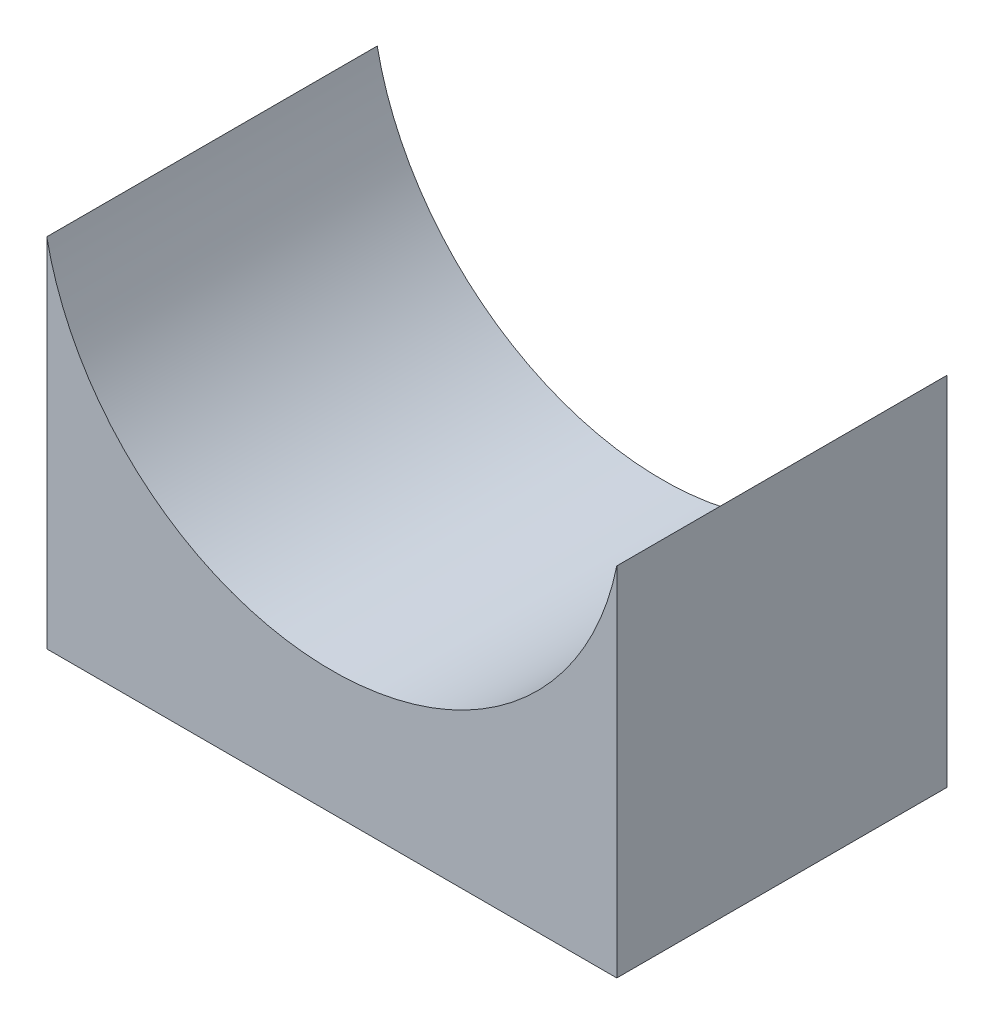
ISO-10303-21;
HEADER;
FILE_DESCRIPTION(('STEP AP214'),'2;1');
FILE_NAME('part.step','',(''),(''),'','','');
FILE_SCHEMA(('AUTOMOTIVE_DESIGN { 1 0 10303 214 1 1 1 1 }'));
ENDSEC;
DATA;
#1=APPLICATION_CONTEXT('core data for automotive mechanical design processes');
#2=APPLICATION_PROTOCOL_DEFINITION('international standard','automotive_design',2000,#1);
#3=PRODUCT_CONTEXT('',#1,'mechanical');
#4=PRODUCT('Part','Part','',(#3));
#5=PRODUCT_RELATED_PRODUCT_CATEGORY('part','',(#4));
#6=PRODUCT_DEFINITION_FORMATION('','',#4);
#7=PRODUCT_DEFINITION_CONTEXT('part definition',#1,'design');
#8=PRODUCT_DEFINITION('design','',#6,#7);
#9=PRODUCT_DEFINITION_SHAPE('','',#8);
#10=(LENGTH_UNIT() NAMED_UNIT(*) SI_UNIT(.MILLI.,.METRE.));
#11=(NAMED_UNIT(*) PLANE_ANGLE_UNIT() SI_UNIT($,.RADIAN.));
#12=(NAMED_UNIT(*) SI_UNIT($,.STERADIAN.) SOLID_ANGLE_UNIT());
#13=UNCERTAINTY_MEASURE_WITH_UNIT(LENGTH_MEASURE(1.E-05),#10,'distance_accuracy_value','');
#14=(GEOMETRIC_REPRESENTATION_CONTEXT(3) GLOBAL_UNCERTAINTY_ASSIGNED_CONTEXT((#13)) GLOBAL_UNIT_ASSIGNED_CONTEXT((#10,
#11,#12)) REPRESENTATION_CONTEXT('',''));
#15=CARTESIAN_POINT('',(0.,0.,0.));
#16=DIRECTION('',(0.,0.,1.));
#17=DIRECTION('',(1.,0.,0.));
#18=AXIS2_PLACEMENT_3D('',#15,#16,#17);
#19=CARTESIAN_POINT('',(-21.9075,-4.43546477271547,25.4));
#20=DIRECTION('',(1.,0.,0.));
#21=DIRECTION('',(0.,0.,-1.));
#22=AXIS2_PLACEMENT_3D('',#19,#20,#21);
#23=PLANE('',#22);
#24=DIRECTION('',(0.,-1.,0.));
#25=VECTOR('',#24,1.);
#26=CARTESIAN_POINT('',(-21.9075,-4.43546477271547,0.));
#27=LINE('',#26,#25);
#28=CARTESIAN_POINT('',(-21.9075,-4.43546477271546,0.));
#29=VERTEX_POINT('',#28);
#30=CARTESIAN_POINT('',(-21.9075,-31.8674647727155,0.));
#31=VERTEX_POINT('',#30);
#32=EDGE_CURVE('E96',#29,#31,#27,.T.);
#33=ORIENTED_EDGE('',*,*,#32,.T.);
#34=DIRECTION('',(0.,0.,-1.));
#35=VECTOR('',#34,1.);
#36=CARTESIAN_POINT('',(-21.9075,-31.8674647727155,25.4));
#37=LINE('',#36,#35);
#38=CARTESIAN_POINT('',(-21.9075,-31.8674647727155,25.4));
#39=VERTEX_POINT('',#38);
#40=EDGE_CURVE('E11',#39,#31,#37,.T.);
#41=ORIENTED_EDGE('',*,*,#40,.F.);
#42=DIRECTION('',(0.,-1.,0.));
#43=VECTOR('',#42,1.);
#44=CARTESIAN_POINT('',(-21.9075,-4.43546477271547,25.4));
#45=LINE('',#44,#43);
#46=CARTESIAN_POINT('',(-21.9075,-4.43546477271546,25.4));
#47=VERTEX_POINT('',#46);
#48=EDGE_CURVE('E84',#47,#39,#45,.T.);
#49=ORIENTED_EDGE('',*,*,#48,.F.);
#50=DIRECTION('',(0.,0.,-1.));
#51=VECTOR('',#50,1.);
#52=CARTESIAN_POINT('',(-21.9075,-4.43546477271546,25.4));
#53=LINE('',#52,#51);
#54=EDGE_CURVE('E92',#47,#29,#53,.T.);
#55=ORIENTED_EDGE('',*,*,#54,.T.);
#56=EDGE_LOOP('',(#33,#41,#49,#55));
#57=FACE_BOUND('',#56,.T.);
#58=ADVANCED_FACE('F33',(#57),#23,.F.);
#59=CARTESIAN_POINT('',(-21.9075,-31.8674647727155,25.4));
#60=DIRECTION('',(0.,1.,0.));
#61=DIRECTION('',(0.,0.,1.));
#62=AXIS2_PLACEMENT_3D('',#59,#60,#61);
#63=PLANE('',#62);
#64=DIRECTION('',(1.,0.,0.));
#65=VECTOR('',#64,1.);
#66=CARTESIAN_POINT('',(-21.9075,-31.8674647727155,0.));
#67=LINE('',#66,#65);
#68=CARTESIAN_POINT('',(21.9075,-31.8674647727155,0.));
#69=VERTEX_POINT('',#68);
#70=EDGE_CURVE('E88',#31,#69,#67,.T.);
#71=ORIENTED_EDGE('',*,*,#70,.T.);
#72=DIRECTION('',(0.,0.,-1.));
#73=VECTOR('',#72,1.);
#74=CARTESIAN_POINT('',(21.9075,-31.8674647727155,25.4));
#75=LINE('',#74,#73);
#76=CARTESIAN_POINT('',(21.9075,-31.8674647727155,25.4));
#77=VERTEX_POINT('',#76);
#78=EDGE_CURVE('E41',#77,#69,#75,.T.);
#79=ORIENTED_EDGE('',*,*,#78,.F.);
#80=DIRECTION('',(1.,0.,0.));
#81=VECTOR('',#80,1.);
#82=CARTESIAN_POINT('',(-21.9075,-31.8674647727155,25.4));
#83=LINE('',#82,#81);
#84=EDGE_CURVE('E79',#39,#77,#83,.T.);
#85=ORIENTED_EDGE('',*,*,#84,.F.);
#86=ORIENTED_EDGE('',*,*,#40,.T.);
#87=EDGE_LOOP('',(#71,#79,#85,#86));
#88=FACE_BOUND('',#87,.T.);
#89=ADVANCED_FACE('F87',(#88),#63,.F.);
#90=CARTESIAN_POINT('',(21.9075,-4.4354647727155,25.4));
#91=DIRECTION('',(-1.,0.,0.));
#92=DIRECTION('',(0.,-1.,0.));
#93=AXIS2_PLACEMENT_3D('',#90,#91,#92);
#94=PLANE('',#93);
#95=DIRECTION('',(0.,1.,0.));
#96=VECTOR('',#95,1.);
#97=CARTESIAN_POINT('',(21.9075,-4.4354647727155,0.));
#98=LINE('',#97,#96);
#99=CARTESIAN_POINT('',(21.9075,-4.4354647727155,0.));
#100=VERTEX_POINT('',#99);
#101=EDGE_CURVE('E66',#69,#100,#98,.T.);
#102=ORIENTED_EDGE('',*,*,#101,.T.);
#103=DIRECTION('',(0.,0.,-1.));
#104=VECTOR('',#103,1.);
#105=CARTESIAN_POINT('',(21.9075,-4.4354647727155,25.4));
#106=LINE('',#105,#104);
#107=CARTESIAN_POINT('',(21.9075,-4.4354647727155,25.4));
#108=VERTEX_POINT('',#107);
#109=EDGE_CURVE('E89',#108,#100,#106,.T.);
#110=ORIENTED_EDGE('',*,*,#109,.F.);
#111=DIRECTION('',(0.,1.,0.));
#112=VECTOR('',#111,1.);
#113=CARTESIAN_POINT('',(21.9075,-4.4354647727155,25.4));
#114=LINE('',#113,#112);
#115=EDGE_CURVE('E82',#77,#108,#114,.T.);
#116=ORIENTED_EDGE('',*,*,#115,.F.);
#117=ORIENTED_EDGE('',*,*,#78,.T.);
#118=EDGE_LOOP('',(#102,#110,#116,#117));
#119=FACE_BOUND('',#118,.T.);
#120=ADVANCED_FACE('F90',(#119),#94,.F.);
#121=CARTESIAN_POINT('',(0.,0.,25.4));
#122=DIRECTION('',(0.,0.,-1.));
#123=DIRECTION('',(-1.,0.,0.));
#124=AXIS2_PLACEMENT_3D('',#121,#122,#123);
#125=CYLINDRICAL_SURFACE('',#124,22.352);
#126=CARTESIAN_POINT('',(0.,0.,0.));
#127=DIRECTION('',(0.,0.,-1.));
#128=DIRECTION('',(1.,0.,0.));
#129=AXIS2_PLACEMENT_3D('',#126,#127,#128);
#130=CIRCLE('',#129,22.352);
#131=EDGE_CURVE('E72',#100,#29,#130,.T.);
#132=ORIENTED_EDGE('',*,*,#131,.T.);
#133=ORIENTED_EDGE('',*,*,#54,.F.);
#134=CARTESIAN_POINT('',(0.,0.,25.4));
#135=DIRECTION('',(0.,0.,-1.));
#136=DIRECTION('',(1.,0.,0.));
#137=AXIS2_PLACEMENT_3D('',#134,#135,#136);
#138=CIRCLE('',#137,22.352);
#139=EDGE_CURVE('E49',#108,#47,#138,.T.);
#140=ORIENTED_EDGE('',*,*,#139,.F.);
#141=ORIENTED_EDGE('',*,*,#109,.T.);
#142=EDGE_LOOP('',(#132,#133,#140,#141));
#143=FACE_BOUND('',#142,.T.);
#144=ADVANCED_FACE('F103',(#143),#125,.F.);
#145=CARTESIAN_POINT('',(0.,0.,25.4));
#146=DIRECTION('',(0.,0.,1.));
#147=DIRECTION('',(1.,0.,0.));
#148=AXIS2_PLACEMENT_3D('',#145,#146,#147);
#149=PLANE('',#148);
#150=ORIENTED_EDGE('',*,*,#48,.T.);
#151=ORIENTED_EDGE('',*,*,#84,.T.);
#152=ORIENTED_EDGE('',*,*,#115,.T.);
#153=ORIENTED_EDGE('',*,*,#139,.T.);
#154=EDGE_LOOP('',(#150,#151,#152,#153));
#155=FACE_BOUND('',#154,.T.);
#156=ADVANCED_FACE('F80',(#155),#149,.T.);
#157=CARTESIAN_POINT('',(0.,0.,0.));
#158=DIRECTION('',(0.,0.,1.));
#159=DIRECTION('',(1.,0.,0.));
#160=AXIS2_PLACEMENT_3D('',#157,#158,#159);
#161=PLANE('',#160);
#162=ORIENTED_EDGE('',*,*,#32,.F.);
#163=ORIENTED_EDGE('',*,*,#131,.F.);
#164=ORIENTED_EDGE('',*,*,#101,.F.);
#165=ORIENTED_EDGE('',*,*,#70,.F.);
#166=EDGE_LOOP('',(#162,#163,#164,#165));
#167=FACE_BOUND('',#166,.T.);
#168=ADVANCED_FACE('F106',(#167),#161,.F.);
#169=CLOSED_SHELL('',(#58,#89,#120,#144,#156,#168));
#170=MANIFOLD_SOLID_BREP('B2',#169);
#171=ADVANCED_BREP_SHAPE_REPRESENTATION('',(#18,#170),#14);
#172=SHAPE_DEFINITION_REPRESENTATION(#9,#171);
ENDSEC;
END-ISO-10303-21;
